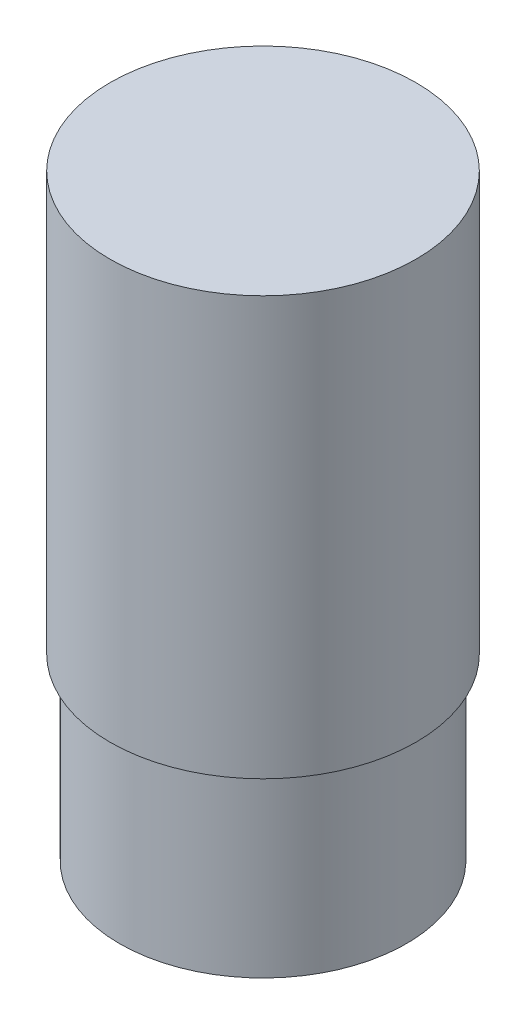
ISO-10303-21;
HEADER;
FILE_DESCRIPTION(('STEP AP214'),'2;1');
FILE_NAME('part.step','',(''),(''),'','','');
FILE_SCHEMA(('AUTOMOTIVE_DESIGN { 1 0 10303 214 1 1 1 1 }'));
ENDSEC;
DATA;
#1=APPLICATION_CONTEXT('core data for automotive mechanical design processes');
#2=APPLICATION_PROTOCOL_DEFINITION('international standard','automotive_design',2000,#1);
#3=PRODUCT_CONTEXT('',#1,'mechanical');
#4=PRODUCT('Part','Part','',(#3));
#5=PRODUCT_RELATED_PRODUCT_CATEGORY('part','',(#4));
#6=PRODUCT_DEFINITION_FORMATION('','',#4);
#7=PRODUCT_DEFINITION_CONTEXT('part definition',#1,'design');
#8=PRODUCT_DEFINITION('design','',#6,#7);
#9=PRODUCT_DEFINITION_SHAPE('','',#8);
#10=(LENGTH_UNIT() NAMED_UNIT(*) SI_UNIT(.MILLI.,.METRE.));
#11=(NAMED_UNIT(*) PLANE_ANGLE_UNIT() SI_UNIT($,.RADIAN.));
#12=(NAMED_UNIT(*) SI_UNIT($,.STERADIAN.) SOLID_ANGLE_UNIT());
#13=UNCERTAINTY_MEASURE_WITH_UNIT(LENGTH_MEASURE(1.E-05),#10,'distance_accuracy_value','');
#14=(GEOMETRIC_REPRESENTATION_CONTEXT(3) GLOBAL_UNCERTAINTY_ASSIGNED_CONTEXT((#13)) GLOBAL_UNIT_ASSIGNED_CONTEXT((#10,
#11,#12)) REPRESENTATION_CONTEXT('',''));
#15=CARTESIAN_POINT('',(0.,0.,0.));
#16=DIRECTION('',(0.,0.,1.));
#17=DIRECTION('',(1.,0.,0.));
#18=AXIS2_PLACEMENT_3D('',#15,#16,#17);
#19=CARTESIAN_POINT('',(0.,15.875,0.));
#20=DIRECTION('',(0.,-1.,0.));
#21=DIRECTION('',(0.,0.,-1.));
#22=AXIS2_PLACEMENT_3D('',#19,#20,#21);
#23=CYLINDRICAL_SURFACE('',#22,4.064);
#24=CARTESIAN_POINT('',(0.,15.875,0.));
#25=DIRECTION('',(0.,1.,0.));
#26=DIRECTION('',(0.,0.,1.));
#27=AXIS2_PLACEMENT_3D('',#24,#25,#26);
#28=CIRCLE('',#27,4.064);
#29=CARTESIAN_POINT('',(0.,15.875,4.064));
#30=VERTEX_POINT('',#29);
#31=EDGE_CURVE('E11',#30,#30,#28,.T.);
#32=ORIENTED_EDGE('',*,*,#31,.F.);
#33=EDGE_LOOP('',(#32));
#34=FACE_BOUND('',#33,.T.);
#35=CARTESIAN_POINT('',(0.,4.7625,0.));
#36=DIRECTION('',(0.,-1.,0.));
#37=DIRECTION('',(0.,0.,-1.));
#38=AXIS2_PLACEMENT_3D('',#35,#36,#37);
#39=CIRCLE('',#38,4.064);
#40=CARTESIAN_POINT('',(0.,4.7625,-4.064));
#41=VERTEX_POINT('',#40);
#42=EDGE_CURVE('E46',#41,#41,#39,.T.);
#43=ORIENTED_EDGE('',*,*,#42,.F.);
#44=EDGE_LOOP('',(#43));
#45=FACE_BOUND('',#44,.T.);
#46=ADVANCED_FACE('F40',(#34,#45),#23,.T.);
#47=CARTESIAN_POINT('',(0.,15.875,0.));
#48=DIRECTION('',(0.,1.,0.));
#49=DIRECTION('',(0.,0.,1.));
#50=AXIS2_PLACEMENT_3D('',#47,#48,#49);
#51=PLANE('',#50);
#52=ORIENTED_EDGE('',*,*,#31,.T.);
#53=EDGE_LOOP('',(#52));
#54=FACE_BOUND('',#53,.T.);
#55=ADVANCED_FACE('F71',(#54),#51,.T.);
#56=CARTESIAN_POINT('',(0.,4.7625,0.));
#57=DIRECTION('',(0.,-1.,0.));
#58=DIRECTION('',(0.,0.,-1.));
#59=AXIS2_PLACEMENT_3D('',#56,#57,#58);
#60=PLANE('',#59);
#61=CARTESIAN_POINT('',(0.,4.7625,0.));
#62=DIRECTION('',(0.,-1.,0.));
#63=DIRECTION('',(0.,0.,-1.));
#64=AXIS2_PLACEMENT_3D('',#61,#62,#63);
#65=CIRCLE('',#64,3.81);
#66=CARTESIAN_POINT('',(0.,4.7625,-3.81));
#67=VERTEX_POINT('',#66);
#68=EDGE_CURVE('E50',#67,#67,#65,.T.);
#69=ORIENTED_EDGE('',*,*,#68,.F.);
#70=EDGE_LOOP('',(#69));
#71=FACE_BOUND('',#70,.T.);
#72=ORIENTED_EDGE('',*,*,#42,.T.);
#73=EDGE_LOOP('',(#72));
#74=FACE_BOUND('',#73,.T.);
#75=ADVANCED_FACE('F64',(#71,#74),#60,.T.);
#76=CARTESIAN_POINT('',(0.,4.7625,0.));
#77=DIRECTION('',(0.,-1.,0.));
#78=DIRECTION('',(0.,0.,-1.));
#79=AXIS2_PLACEMENT_3D('',#76,#77,#78);
#80=CYLINDRICAL_SURFACE('',#79,3.81);
#81=CARTESIAN_POINT('',(0.,0.,0.));
#82=DIRECTION('',(0.,-1.,0.));
#83=DIRECTION('',(0.,0.,-1.));
#84=AXIS2_PLACEMENT_3D('',#81,#82,#83);
#85=CIRCLE('',#84,3.81);
#86=CARTESIAN_POINT('',(0.,0.,-3.81));
#87=VERTEX_POINT('',#86);
#88=EDGE_CURVE('E54',#87,#87,#85,.T.);
#89=CARTESIAN_POINT('',(0.,4.7625,-3.81));
#90=CARTESIAN_POINT('',(0.,4.712890625,-3.81));
#91=CARTESIAN_POINT('',(0.,4.66328125,-3.81));
#92=CARTESIAN_POINT('',(0.,4.5640625,-3.81));
#93=CARTESIAN_POINT('',(0.,4.514453125,-3.81));
#94=CARTESIAN_POINT('',(0.,4.415234375,-3.81));
#95=CARTESIAN_POINT('',(0.,4.365625,-3.81));
#96=CARTESIAN_POINT('',(0.,4.26640625,-3.81));
#97=CARTESIAN_POINT('',(0.,4.216796875,-3.81));
#98=CARTESIAN_POINT('',(0.,4.117578125,-3.81));
#99=CARTESIAN_POINT('',(0.,4.06796875,-3.81));
#100=CARTESIAN_POINT('',(0.,3.96875,-3.81));
#101=CARTESIAN_POINT('',(0.,3.919140625,-3.81));
#102=CARTESIAN_POINT('',(0.,3.819921875,-3.81));
#103=CARTESIAN_POINT('',(0.,3.7703125,-3.81));
#104=CARTESIAN_POINT('',(0.,3.67109375,-3.81));
#105=CARTESIAN_POINT('',(0.,3.621484375,-3.81));
#106=CARTESIAN_POINT('',(0.,3.522265625,-3.81));
#107=CARTESIAN_POINT('',(0.,3.47265625,-3.81));
#108=CARTESIAN_POINT('',(0.,3.3734375,-3.81));
#109=CARTESIAN_POINT('',(0.,3.323828125,-3.81));
#110=CARTESIAN_POINT('',(0.,3.224609375,-3.81));
#111=CARTESIAN_POINT('',(0.,3.175,-3.81));
#112=CARTESIAN_POINT('',(0.,3.07578125,-3.81));
#113=CARTESIAN_POINT('',(0.,3.026171875,-3.81));
#114=CARTESIAN_POINT('',(0.,2.926953125,-3.81));
#115=CARTESIAN_POINT('',(0.,2.87734375,-3.81));
#116=CARTESIAN_POINT('',(0.,2.778125,-3.81));
#117=CARTESIAN_POINT('',(0.,2.728515625,-3.81));
#118=CARTESIAN_POINT('',(0.,2.629296875,-3.81));
#119=CARTESIAN_POINT('',(0.,2.5796875,-3.81));
#120=CARTESIAN_POINT('',(0.,2.48046875,-3.81));
#121=CARTESIAN_POINT('',(0.,2.430859375,-3.81));
#122=CARTESIAN_POINT('',(0.,2.331640625,-3.81));
#123=CARTESIAN_POINT('',(0.,2.28203125,-3.81));
#124=CARTESIAN_POINT('',(0.,2.1828125,-3.81));
#125=CARTESIAN_POINT('',(0.,2.133203125,-3.81));
#126=CARTESIAN_POINT('',(0.,2.033984375,-3.81));
#127=CARTESIAN_POINT('',(0.,1.984375,-3.81));
#128=CARTESIAN_POINT('',(0.,1.88515625,-3.81));
#129=CARTESIAN_POINT('',(0.,1.835546875,-3.81));
#130=CARTESIAN_POINT('',(0.,1.736328125,-3.81));
#131=CARTESIAN_POINT('',(0.,1.68671875,-3.81));
#132=CARTESIAN_POINT('',(0.,1.5875,-3.81));
#133=CARTESIAN_POINT('',(0.,1.537890625,-3.81));
#134=CARTESIAN_POINT('',(0.,1.438671875,-3.81));
#135=CARTESIAN_POINT('',(0.,1.3890625,-3.81));
#136=CARTESIAN_POINT('',(0.,1.28984375,-3.81));
#137=CARTESIAN_POINT('',(0.,1.240234375,-3.81));
#138=CARTESIAN_POINT('',(0.,1.141015625,-3.81));
#139=CARTESIAN_POINT('',(0.,1.09140625,-3.81));
#140=CARTESIAN_POINT('',(0.,0.9921875,-3.81));
#141=CARTESIAN_POINT('',(0.,0.942578125,-3.81));
#142=CARTESIAN_POINT('',(0.,0.843359375,-3.81));
#143=CARTESIAN_POINT('',(0.,0.79375,-3.81));
#144=CARTESIAN_POINT('',(0.,0.69453125,-3.81));
#145=CARTESIAN_POINT('',(0.,0.644921875,-3.81));
#146=CARTESIAN_POINT('',(0.,0.545703125,-3.81));
#147=CARTESIAN_POINT('',(0.,0.49609375,-3.81));
#148=CARTESIAN_POINT('',(0.,0.396875,-3.81));
#149=CARTESIAN_POINT('',(0.,0.347265625,-3.81));
#150=CARTESIAN_POINT('',(0.,0.248046875,-3.81));
#151=CARTESIAN_POINT('',(0.,0.1984375,-3.81));
#152=CARTESIAN_POINT('',(0.,0.09921875,-3.81));
#153=CARTESIAN_POINT('',(0.,0.049609375,-3.81));
#154=CARTESIAN_POINT('',(0.,0.,-3.81));
#155=B_SPLINE_CURVE_WITH_KNOTS('',3,(#89,#90,#91,#92,#93,#94,#95,#96,#97,#98,#99,#100,#101,#102,
#103,#104,#105,#106,#107,#108,#109,#110,#111,#112,#113,#114,#115,#116,#117,#118,#119,#120,#121,
#122,#123,#124,#125,#126,#127,#128,#129,#130,#131,#132,#133,#134,#135,#136,#137,#138,#139,#140,
#141,#142,#143,#144,#145,#146,#147,#148,#149,#150,#151,#152,#153,#154),.UNSPECIFIED.,.F.,.F.,(4,
2,2,2,2,2,2,2,2,2,2,2,2,2,2,2,2,2,2,2,2,2,2,2,2,2,2,2,2,2,2,2,4),(0.,0.148828125,0.29765625,
0.446484375,0.5953125,0.744140625,0.892968750000001,1.041796875,1.190625,1.339453125,1.48828125,
1.637109375,1.7859375,1.934765625,2.08359375,2.232421875,2.38125,2.530078125,2.67890625,
2.827734375,2.9765625,3.125390625,3.27421875,3.423046875,3.571875,3.720703125,3.86953125,
4.018359375,4.1671875,4.316015625,4.46484375,4.613671875,4.7625),.UNSPECIFIED.);
#156=EDGE_CURVE('BSEAM62',#67,#87,#155,.T.);
#157=ORIENTED_EDGE('',*,*,#68,.T.);
#158=ORIENTED_EDGE('',*,*,#88,.F.);
#159=ORIENTED_EDGE('',*,*,#156,.T.);
#160=ORIENTED_EDGE('',*,*,#156,.F.);
#161=EDGE_LOOP('',(#157,#159,#158,#160));
#162=FACE_BOUND('',#161,.T.);
#163=ADVANCED_FACE('F62',(#162),#80,.T.);
#164=CARTESIAN_POINT('',(0.,0.,0.));
#165=DIRECTION('',(0.,1.,0.));
#166=DIRECTION('',(0.,0.,1.));
#167=AXIS2_PLACEMENT_3D('',#164,#165,#166);
#168=PLANE('',#167);
#169=ORIENTED_EDGE('',*,*,#88,.T.);
#170=EDGE_LOOP('',(#169));
#171=FACE_BOUND('',#170,.T.);
#172=ADVANCED_FACE('F60',(#171),#168,.F.);
#173=CLOSED_SHELL('',(#46,#55,#75,#163,#172));
#174=MANIFOLD_SOLID_BREP('B2',#173);
#175=ADVANCED_BREP_SHAPE_REPRESENTATION('',(#18,#174),#14);
#176=SHAPE_DEFINITION_REPRESENTATION(#9,#175);
ENDSEC;
END-ISO-10303-21;
